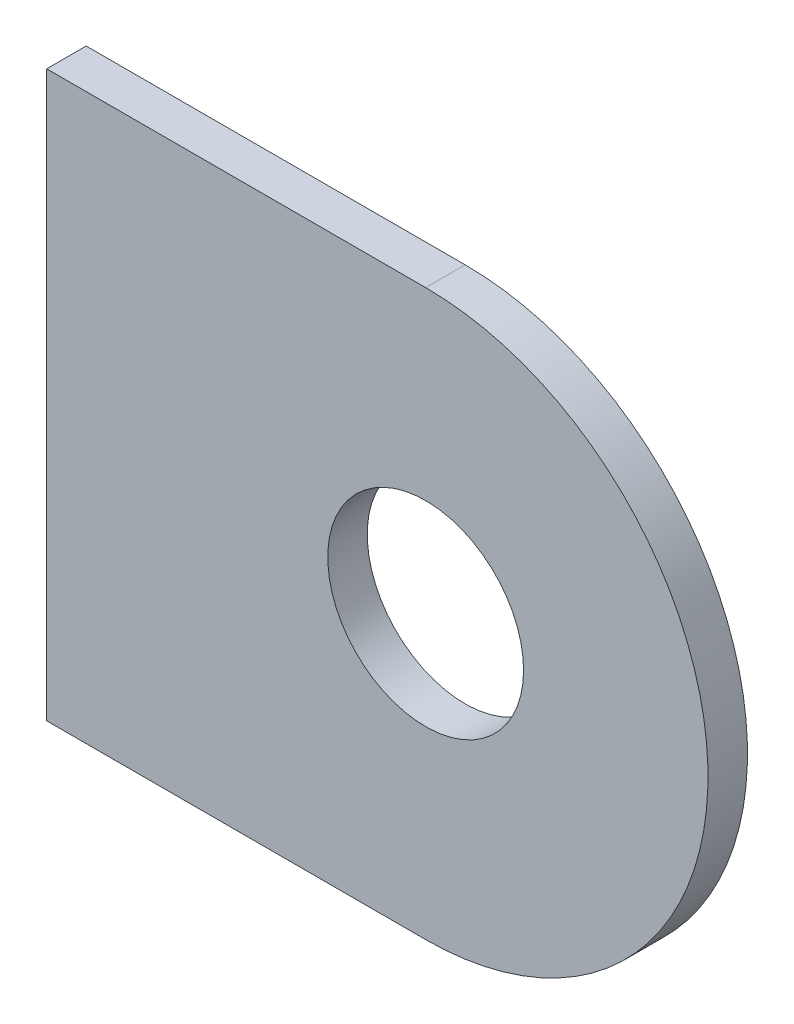
ISO-10303-21;
HEADER;
FILE_DESCRIPTION(('STEP AP214'),'2;1');
FILE_NAME('part.step','',(''),(''),'','','');
FILE_SCHEMA(('AUTOMOTIVE_DESIGN { 1 0 10303 214 1 1 1 1 }'));
ENDSEC;
DATA;
#1=APPLICATION_CONTEXT('core data for automotive mechanical design processes');
#2=APPLICATION_PROTOCOL_DEFINITION('international standard','automotive_design',2000,#1);
#3=PRODUCT_CONTEXT('',#1,'mechanical');
#4=PRODUCT('Part','Part','',(#3));
#5=PRODUCT_RELATED_PRODUCT_CATEGORY('part','',(#4));
#6=PRODUCT_DEFINITION_FORMATION('','',#4);
#7=PRODUCT_DEFINITION_CONTEXT('part definition',#1,'design');
#8=PRODUCT_DEFINITION('design','',#6,#7);
#9=PRODUCT_DEFINITION_SHAPE('','',#8);
#10=(LENGTH_UNIT() NAMED_UNIT(*) SI_UNIT(.MILLI.,.METRE.));
#11=(NAMED_UNIT(*) PLANE_ANGLE_UNIT() SI_UNIT($,.RADIAN.));
#12=(NAMED_UNIT(*) SI_UNIT($,.STERADIAN.) SOLID_ANGLE_UNIT());
#13=UNCERTAINTY_MEASURE_WITH_UNIT(LENGTH_MEASURE(1.E-05),#10,'distance_accuracy_value','');
#14=(GEOMETRIC_REPRESENTATION_CONTEXT(3) GLOBAL_UNCERTAINTY_ASSIGNED_CONTEXT((#13)) GLOBAL_UNIT_ASSIGNED_CONTEXT((#10,
#11,#12)) REPRESENTATION_CONTEXT('',''));
#15=CARTESIAN_POINT('',(0.,0.,0.));
#16=DIRECTION('',(0.,0.,1.));
#17=DIRECTION('',(1.,0.,0.));
#18=AXIS2_PLACEMENT_3D('',#15,#16,#17);
#19=CARTESIAN_POINT('',(15.24,11.3538,1.5875));
#20=DIRECTION('',(0.,0.,1.));
#21=DIRECTION('',(1.,0.,0.));
#22=AXIS2_PLACEMENT_3D('',#19,#20,#21);
#23=PLANE('',#22);
#24=DIRECTION('',(0.,-1.,0.));
#25=VECTOR('',#24,1.);
#26=CARTESIAN_POINT('',(0.,0.,1.5875));
#27=LINE('',#26,#25);
#28=CARTESIAN_POINT('',(0.,22.7076,1.5875));
#29=VERTEX_POINT('',#28);
#30=CARTESIAN_POINT('',(0.,0.,1.5875));
#31=VERTEX_POINT('',#30);
#32=EDGE_CURVE('E91',#29,#31,#27,.T.);
#33=ORIENTED_EDGE('',*,*,#32,.T.);
#34=DIRECTION('',(1.,0.,0.));
#35=VECTOR('',#34,1.);
#36=CARTESIAN_POINT('',(0.,0.,1.5875));
#37=LINE('',#36,#35);
#38=CARTESIAN_POINT('',(15.24,0.,1.5875));
#39=VERTEX_POINT('',#38);
#40=EDGE_CURVE('E86',#31,#39,#37,.T.);
#41=ORIENTED_EDGE('',*,*,#40,.T.);
#42=CARTESIAN_POINT('',(15.24,11.3538,1.5875));
#43=DIRECTION('',(0.,0.,1.));
#44=DIRECTION('',(1.,0.,0.));
#45=AXIS2_PLACEMENT_3D('',#42,#43,#44);
#46=CIRCLE('',#45,11.3538);
#47=CARTESIAN_POINT('',(15.24,22.7076,1.5875));
#48=VERTEX_POINT('',#47);
#49=EDGE_CURVE('E89',#39,#48,#46,.T.);
#50=ORIENTED_EDGE('',*,*,#49,.T.);
#51=DIRECTION('',(-1.,0.,0.));
#52=VECTOR('',#51,1.);
#53=CARTESIAN_POINT('',(0.,22.7076,1.5875));
#54=LINE('',#53,#52);
#55=EDGE_CURVE('E56',#48,#29,#54,.T.);
#56=ORIENTED_EDGE('',*,*,#55,.T.);
#57=EDGE_LOOP('',(#33,#41,#50,#56));
#58=FACE_BOUND('',#57,.T.);
#59=CARTESIAN_POINT('',(15.24,11.3538,1.5875));
#60=DIRECTION('',(0.,0.,1.));
#61=DIRECTION('',(1.,0.,0.));
#62=AXIS2_PLACEMENT_3D('',#59,#60,#61);
#63=CIRCLE('',#62,3.937);
#64=CARTESIAN_POINT('',(19.177,11.3538,1.5875));
#65=VERTEX_POINT('',#64);
#66=EDGE_CURVE('E106',#65,#65,#63,.T.);
#67=ORIENTED_EDGE('',*,*,#66,.F.);
#68=EDGE_LOOP('',(#67));
#69=FACE_BOUND('',#68,.T.);
#70=ADVANCED_FACE('F39',(#58,#69),#23,.T.);
#71=CARTESIAN_POINT('',(15.24,11.3538,0.));
#72=DIRECTION('',(0.,0.,1.));
#73=DIRECTION('',(1.,0.,0.));
#74=AXIS2_PLACEMENT_3D('',#71,#72,#73);
#75=PLANE('',#74);
#76=DIRECTION('',(0.,-1.,0.));
#77=VECTOR('',#76,1.);
#78=CARTESIAN_POINT('',(0.,0.,0.));
#79=LINE('',#78,#77);
#80=CARTESIAN_POINT('',(0.,22.7076,0.));
#81=VERTEX_POINT('',#80);
#82=CARTESIAN_POINT('',(0.,0.,0.));
#83=VERTEX_POINT('',#82);
#84=EDGE_CURVE('E103',#81,#83,#79,.T.);
#85=ORIENTED_EDGE('',*,*,#84,.F.);
#86=DIRECTION('',(-1.,0.,0.));
#87=VECTOR('',#86,1.);
#88=CARTESIAN_POINT('',(0.,22.7076,0.));
#89=LINE('',#88,#87);
#90=CARTESIAN_POINT('',(15.24,22.7076,0.));
#91=VERTEX_POINT('',#90);
#92=EDGE_CURVE('E79',#91,#81,#89,.T.);
#93=ORIENTED_EDGE('',*,*,#92,.F.);
#94=CARTESIAN_POINT('',(15.24,11.3538,0.));
#95=DIRECTION('',(0.,0.,1.));
#96=DIRECTION('',(1.,0.,0.));
#97=AXIS2_PLACEMENT_3D('',#94,#95,#96);
#98=CIRCLE('',#97,11.3538);
#99=CARTESIAN_POINT('',(15.24,0.,0.));
#100=VERTEX_POINT('',#99);
#101=EDGE_CURVE('E73',#100,#91,#98,.T.);
#102=ORIENTED_EDGE('',*,*,#101,.F.);
#103=DIRECTION('',(1.,0.,0.));
#104=VECTOR('',#103,1.);
#105=CARTESIAN_POINT('',(0.,0.,0.));
#106=LINE('',#105,#104);
#107=EDGE_CURVE('E95',#83,#100,#106,.T.);
#108=ORIENTED_EDGE('',*,*,#107,.F.);
#109=EDGE_LOOP('',(#85,#93,#102,#108));
#110=FACE_BOUND('',#109,.T.);
#111=CARTESIAN_POINT('',(15.24,11.3538,0.));
#112=DIRECTION('',(0.,0.,1.));
#113=DIRECTION('',(1.,0.,0.));
#114=AXIS2_PLACEMENT_3D('',#111,#112,#113);
#115=CIRCLE('',#114,3.937);
#116=CARTESIAN_POINT('',(19.177,11.3538,0.));
#117=VERTEX_POINT('',#116);
#118=EDGE_CURVE('E118',#117,#117,#115,.T.);
#119=ORIENTED_EDGE('',*,*,#118,.T.);
#120=EDGE_LOOP('',(#119));
#121=FACE_BOUND('',#120,.T.);
#122=ADVANCED_FACE('F114',(#110,#121),#75,.F.);
#123=CARTESIAN_POINT('',(0.,0.,1.5875));
#124=DIRECTION('',(1.,0.,0.));
#125=DIRECTION('',(0.,1.,0.));
#126=AXIS2_PLACEMENT_3D('',#123,#124,#125);
#127=PLANE('',#126);
#128=ORIENTED_EDGE('',*,*,#84,.T.);
#129=DIRECTION('',(0.,0.,-1.));
#130=VECTOR('',#129,1.);
#131=CARTESIAN_POINT('',(0.,0.,1.5875));
#132=LINE('',#131,#130);
#133=EDGE_CURVE('E11',#31,#83,#132,.T.);
#134=ORIENTED_EDGE('',*,*,#133,.F.);
#135=ORIENTED_EDGE('',*,*,#32,.F.);
#136=DIRECTION('',(0.,0.,-1.));
#137=VECTOR('',#136,1.);
#138=CARTESIAN_POINT('',(0.,22.7076,1.5875));
#139=LINE('',#138,#137);
#140=EDGE_CURVE('E99',#29,#81,#139,.T.);
#141=ORIENTED_EDGE('',*,*,#140,.T.);
#142=EDGE_LOOP('',(#128,#134,#135,#141));
#143=FACE_BOUND('',#142,.T.);
#144=ADVANCED_FACE('F41',(#143),#127,.F.);
#145=CARTESIAN_POINT('',(0.,0.,1.5875));
#146=DIRECTION('',(0.,1.,0.));
#147=DIRECTION('',(0.,0.,1.));
#148=AXIS2_PLACEMENT_3D('',#145,#146,#147);
#149=PLANE('',#148);
#150=ORIENTED_EDGE('',*,*,#107,.T.);
#151=DIRECTION('',(0.,0.,-1.));
#152=VECTOR('',#151,1.);
#153=CARTESIAN_POINT('',(15.24,0.,1.5875));
#154=LINE('',#153,#152);
#155=EDGE_CURVE('E48',#39,#100,#154,.T.);
#156=ORIENTED_EDGE('',*,*,#155,.F.);
#157=ORIENTED_EDGE('',*,*,#40,.F.);
#158=ORIENTED_EDGE('',*,*,#133,.T.);
#159=EDGE_LOOP('',(#150,#156,#157,#158));
#160=FACE_BOUND('',#159,.T.);
#161=ADVANCED_FACE('F94',(#160),#149,.F.);
#162=CARTESIAN_POINT('',(15.24,11.3538,1.5875));
#163=DIRECTION('',(0.,0.,-1.));
#164=DIRECTION('',(-1.,0.,0.));
#165=AXIS2_PLACEMENT_3D('',#162,#163,#164);
#166=CYLINDRICAL_SURFACE('',#165,11.3538);
#167=ORIENTED_EDGE('',*,*,#101,.T.);
#168=DIRECTION('',(0.,0.,-1.));
#169=VECTOR('',#168,1.);
#170=CARTESIAN_POINT('',(15.24,22.7076,1.5875));
#171=LINE('',#170,#169);
#172=EDGE_CURVE('E96',#48,#91,#171,.T.);
#173=ORIENTED_EDGE('',*,*,#172,.F.);
#174=ORIENTED_EDGE('',*,*,#49,.F.);
#175=ORIENTED_EDGE('',*,*,#155,.T.);
#176=EDGE_LOOP('',(#167,#173,#174,#175));
#177=FACE_BOUND('',#176,.T.);
#178=ADVANCED_FACE('F97',(#177),#166,.T.);
#179=CARTESIAN_POINT('',(0.,22.7076,1.5875));
#180=DIRECTION('',(0.,-1.,0.));
#181=DIRECTION('',(0.,0.,-1.));
#182=AXIS2_PLACEMENT_3D('',#179,#180,#181);
#183=PLANE('',#182);
#184=ORIENTED_EDGE('',*,*,#92,.T.);
#185=ORIENTED_EDGE('',*,*,#140,.F.);
#186=ORIENTED_EDGE('',*,*,#55,.F.);
#187=ORIENTED_EDGE('',*,*,#172,.T.);
#188=EDGE_LOOP('',(#184,#185,#186,#187));
#189=FACE_BOUND('',#188,.T.);
#190=ADVANCED_FACE('F111',(#189),#183,.F.);
#191=CARTESIAN_POINT('',(15.24,11.3538,1.5875));
#192=DIRECTION('',(0.,0.,-1.));
#193=DIRECTION('',(-1.,0.,0.));
#194=AXIS2_PLACEMENT_3D('',#191,#192,#193);
#195=CYLINDRICAL_SURFACE('',#194,3.937);
#196=ORIENTED_EDGE('',*,*,#66,.T.);
#197=EDGE_LOOP('',(#196));
#198=FACE_BOUND('',#197,.T.);
#199=ORIENTED_EDGE('',*,*,#118,.F.);
#200=EDGE_LOOP('',(#199));
#201=FACE_BOUND('',#200,.T.);
#202=ADVANCED_FACE('F124',(#198,#201),#195,.F.);
#203=CLOSED_SHELL('',(#70,#122,#144,#161,#178,#190,#202));
#204=MANIFOLD_SOLID_BREP('B2',#203);
#205=ADVANCED_BREP_SHAPE_REPRESENTATION('',(#18,#204),#14);
#206=SHAPE_DEFINITION_REPRESENTATION(#9,#205);
ENDSEC;
END-ISO-10303-21;
